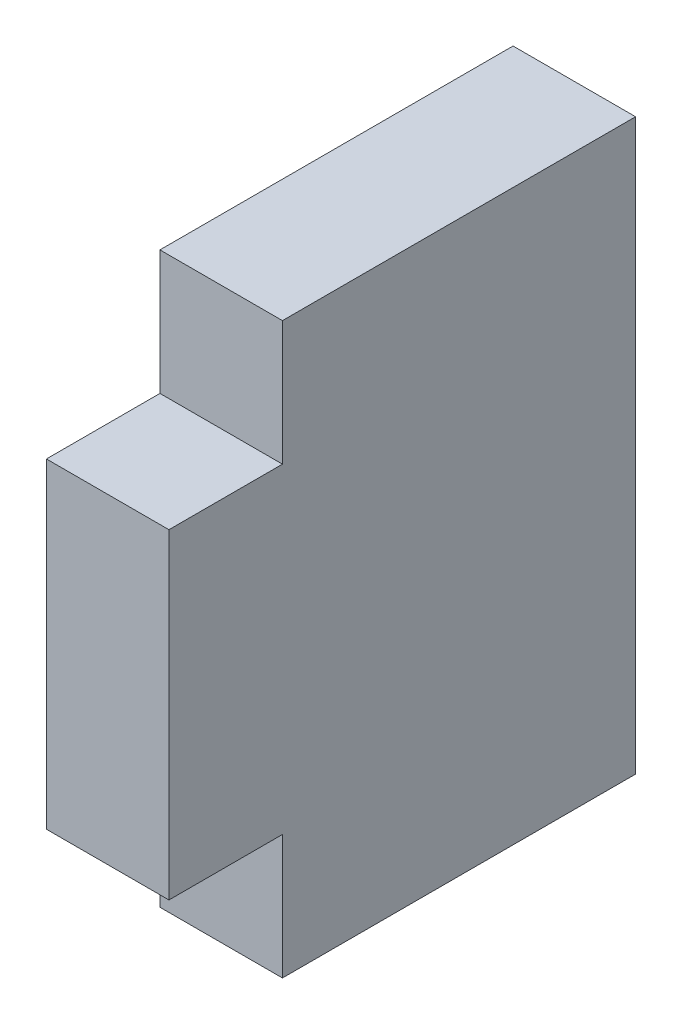
ISO-10303-21;
HEADER;
FILE_DESCRIPTION(('STEP AP214'),'2;1');
FILE_NAME('part.step','',(''),(''),'','','');
FILE_SCHEMA(('AUTOMOTIVE_DESIGN { 1 0 10303 214 1 1 1 1 }'));
ENDSEC;
DATA;
#1=APPLICATION_CONTEXT('core data for automotive mechanical design processes');
#2=APPLICATION_PROTOCOL_DEFINITION('international standard','automotive_design',2000,#1);
#3=PRODUCT_CONTEXT('',#1,'mechanical');
#4=PRODUCT('Part','Part','',(#3));
#5=PRODUCT_RELATED_PRODUCT_CATEGORY('part','',(#4));
#6=PRODUCT_DEFINITION_FORMATION('','',#4);
#7=PRODUCT_DEFINITION_CONTEXT('part definition',#1,'design');
#8=PRODUCT_DEFINITION('design','',#6,#7);
#9=PRODUCT_DEFINITION_SHAPE('','',#8);
#10=(LENGTH_UNIT() NAMED_UNIT(*) SI_UNIT(.MILLI.,.METRE.));
#11=(NAMED_UNIT(*) PLANE_ANGLE_UNIT() SI_UNIT($,.RADIAN.));
#12=(NAMED_UNIT(*) SI_UNIT($,.STERADIAN.) SOLID_ANGLE_UNIT());
#13=UNCERTAINTY_MEASURE_WITH_UNIT(LENGTH_MEASURE(1.E-05),#10,'distance_accuracy_value','');
#14=(GEOMETRIC_REPRESENTATION_CONTEXT(3) GLOBAL_UNCERTAINTY_ASSIGNED_CONTEXT((#13)) GLOBAL_UNIT_ASSIGNED_CONTEXT((#10,
#11,#12)) REPRESENTATION_CONTEXT('',''));
#15=CARTESIAN_POINT('',(0.,0.,0.));
#16=DIRECTION('',(0.,0.,1.));
#17=DIRECTION('',(1.,0.,0.));
#18=AXIS2_PLACEMENT_3D('',#15,#16,#17);
#19=CARTESIAN_POINT('',(17.272,0.,0.));
#20=DIRECTION('',(1.,0.,0.));
#21=DIRECTION('',(0.,0.,-1.));
#22=AXIS2_PLACEMENT_3D('',#19,#20,#21);
#23=PLANE('',#22);
#24=DIRECTION('',(0.,0.,1.));
#25=VECTOR('',#24,1.);
#26=CARTESIAN_POINT('',(17.272,80.264,-49.784));
#27=LINE('',#26,#25);
#28=CARTESIAN_POINT('',(17.272,80.264,0.));
#29=VERTEX_POINT('',#28);
#30=CARTESIAN_POINT('',(17.272,80.264,-49.784));
#31=VERTEX_POINT('',#30);
#32=EDGE_CURVE('E93',#29,#31,#27,.F.);
#33=ORIENTED_EDGE('',*,*,#32,.F.);
#34=DIRECTION('',(0.,1.,0.));
#35=VECTOR('',#34,1.);
#36=CARTESIAN_POINT('',(17.272,80.264,0.));
#37=LINE('',#36,#35);
#38=CARTESIAN_POINT('',(17.272,62.738,0.));
#39=VERTEX_POINT('',#38);
#40=EDGE_CURVE('E19',#39,#29,#37,.T.);
#41=ORIENTED_EDGE('',*,*,#40,.F.);
#42=DIRECTION('',(0.,0.,1.));
#43=VECTOR('',#42,1.);
#44=CARTESIAN_POINT('',(17.272,62.738,0.));
#45=LINE('',#44,#43);
#46=CARTESIAN_POINT('',(17.272,62.738,16.002));
#47=VERTEX_POINT('',#46);
#48=EDGE_CURVE('E82',#47,#39,#45,.F.);
#49=ORIENTED_EDGE('',*,*,#48,.F.);
#50=DIRECTION('',(0.,1.,0.));
#51=VECTOR('',#50,1.);
#52=CARTESIAN_POINT('',(17.272,62.738,16.002));
#53=LINE('',#52,#51);
#54=CARTESIAN_POINT('',(17.272,17.526,16.002));
#55=VERTEX_POINT('',#54);
#56=EDGE_CURVE('E77',#55,#47,#53,.T.);
#57=ORIENTED_EDGE('',*,*,#56,.F.);
#58=DIRECTION('',(0.,0.,-1.));
#59=VECTOR('',#58,1.);
#60=CARTESIAN_POINT('',(17.272,17.526,16.002));
#61=LINE('',#60,#59);
#62=CARTESIAN_POINT('',(17.272,17.526,0.));
#63=VERTEX_POINT('',#62);
#64=EDGE_CURVE('E104',#63,#55,#61,.F.);
#65=ORIENTED_EDGE('',*,*,#64,.F.);
#66=DIRECTION('',(0.,1.,0.));
#67=VECTOR('',#66,1.);
#68=CARTESIAN_POINT('',(17.272,17.526,0.));
#69=LINE('',#68,#67);
#70=CARTESIAN_POINT('',(17.272,0.,0.));
#71=VERTEX_POINT('',#70);
#72=EDGE_CURVE('E108',#71,#63,#69,.T.);
#73=ORIENTED_EDGE('',*,*,#72,.F.);
#74=DIRECTION('',(0.,0.,-1.));
#75=VECTOR('',#74,1.);
#76=CARTESIAN_POINT('',(17.272,0.,0.));
#77=LINE('',#76,#75);
#78=CARTESIAN_POINT('',(17.272,0.,-49.784));
#79=VERTEX_POINT('',#78);
#80=EDGE_CURVE('E112',#79,#71,#77,.F.);
#81=ORIENTED_EDGE('',*,*,#80,.F.);
#82=DIRECTION('',(0.,1.,0.));
#83=VECTOR('',#82,1.);
#84=CARTESIAN_POINT('',(17.272,0.,-49.784));
#85=LINE('',#84,#83);
#86=EDGE_CURVE('E116',#31,#79,#85,.F.);
#87=ORIENTED_EDGE('',*,*,#86,.F.);
#88=EDGE_LOOP('',(#33,#41,#49,#57,#65,#73,#81,#87));
#89=FACE_BOUND('',#88,.T.);
#90=ADVANCED_FACE('F16',(#89),#23,.T.);
#91=CARTESIAN_POINT('',(0.,80.264,0.));
#92=DIRECTION('',(0.,0.,1.));
#93=DIRECTION('',(1.,0.,0.));
#94=AXIS2_PLACEMENT_3D('',#91,#92,#93);
#95=PLANE('',#94);
#96=DIRECTION('',(1.,0.,0.));
#97=VECTOR('',#96,1.);
#98=CARTESIAN_POINT('',(0.,80.264,0.));
#99=LINE('',#98,#97);
#100=CARTESIAN_POINT('',(0.,80.264,0.));
#101=VERTEX_POINT('',#100);
#102=EDGE_CURVE('E120',#101,#29,#99,.T.);
#103=ORIENTED_EDGE('',*,*,#102,.F.);
#104=DIRECTION('',(0.,1.,0.));
#105=VECTOR('',#104,1.);
#106=CARTESIAN_POINT('',(0.,0.,0.));
#107=LINE('',#106,#105);
#108=CARTESIAN_POINT('',(0.,62.738,0.));
#109=VERTEX_POINT('',#108);
#110=EDGE_CURVE('E99',#101,#109,#107,.F.);
#111=ORIENTED_EDGE('',*,*,#110,.T.);
#112=DIRECTION('',(1.,0.,0.));
#113=VECTOR('',#112,1.);
#114=CARTESIAN_POINT('',(0.,62.738,0.));
#115=LINE('',#114,#113);
#116=EDGE_CURVE('E87',#39,#109,#115,.F.);
#117=ORIENTED_EDGE('',*,*,#116,.F.);
#118=ORIENTED_EDGE('',*,*,#40,.T.);
#119=EDGE_LOOP('',(#103,#111,#117,#118));
#120=FACE_BOUND('',#119,.T.);
#121=ADVANCED_FACE('F98',(#120),#95,.T.);
#122=CARTESIAN_POINT('',(0.,62.738,0.));
#123=DIRECTION('',(0.,1.,0.));
#124=DIRECTION('',(0.,0.,1.));
#125=AXIS2_PLACEMENT_3D('',#122,#123,#124);
#126=PLANE('',#125);
#127=ORIENTED_EDGE('',*,*,#116,.T.);
#128=DIRECTION('',(0.,0.,-1.));
#129=VECTOR('',#128,1.);
#130=CARTESIAN_POINT('',(0.,62.738,0.));
#131=LINE('',#130,#129);
#132=CARTESIAN_POINT('',(0.,62.738,16.002));
#133=VERTEX_POINT('',#132);
#134=EDGE_CURVE('E125',#109,#133,#131,.F.);
#135=ORIENTED_EDGE('',*,*,#134,.T.);
#136=DIRECTION('',(1.,0.,0.));
#137=VECTOR('',#136,1.);
#138=CARTESIAN_POINT('',(0.,62.738,16.002));
#139=LINE('',#138,#137);
#140=EDGE_CURVE('E89',#47,#133,#139,.F.);
#141=ORIENTED_EDGE('',*,*,#140,.F.);
#142=ORIENTED_EDGE('',*,*,#48,.T.);
#143=EDGE_LOOP('',(#127,#135,#141,#142));
#144=FACE_BOUND('',#143,.T.);
#145=ADVANCED_FACE('F84',(#144),#126,.T.);
#146=CARTESIAN_POINT('',(0.,62.738,16.002));
#147=DIRECTION('',(0.,0.,1.));
#148=DIRECTION('',(1.,0.,0.));
#149=AXIS2_PLACEMENT_3D('',#146,#147,#148);
#150=PLANE('',#149);
#151=ORIENTED_EDGE('',*,*,#140,.T.);
#152=DIRECTION('',(0.,1.,0.));
#153=VECTOR('',#152,1.);
#154=CARTESIAN_POINT('',(0.,0.,16.002));
#155=LINE('',#154,#153);
#156=CARTESIAN_POINT('',(0.,17.526,16.002));
#157=VERTEX_POINT('',#156);
#158=EDGE_CURVE('E127',#133,#157,#155,.F.);
#159=ORIENTED_EDGE('',*,*,#158,.T.);
#160=DIRECTION('',(1.,0.,0.));
#161=VECTOR('',#160,1.);
#162=CARTESIAN_POINT('',(0.,17.526,16.002));
#163=LINE('',#162,#161);
#164=EDGE_CURVE('E106',#55,#157,#163,.F.);
#165=ORIENTED_EDGE('',*,*,#164,.F.);
#166=ORIENTED_EDGE('',*,*,#56,.T.);
#167=EDGE_LOOP('',(#151,#159,#165,#166));
#168=FACE_BOUND('',#167,.T.);
#169=ADVANCED_FACE('F161',(#168),#150,.T.);
#170=CARTESIAN_POINT('',(0.,17.526,16.002));
#171=DIRECTION('',(0.,-1.,0.));
#172=DIRECTION('',(0.,0.,-1.));
#173=AXIS2_PLACEMENT_3D('',#170,#171,#172);
#174=PLANE('',#173);
#175=ORIENTED_EDGE('',*,*,#164,.T.);
#176=DIRECTION('',(0.,0.,-1.));
#177=VECTOR('',#176,1.);
#178=CARTESIAN_POINT('',(0.,17.526,0.));
#179=LINE('',#178,#177);
#180=CARTESIAN_POINT('',(0.,17.526,0.));
#181=VERTEX_POINT('',#180);
#182=EDGE_CURVE('E130',#157,#181,#179,.T.);
#183=ORIENTED_EDGE('',*,*,#182,.T.);
#184=DIRECTION('',(1.,0.,0.));
#185=VECTOR('',#184,1.);
#186=CARTESIAN_POINT('',(0.,17.526,0.));
#187=LINE('',#186,#185);
#188=EDGE_CURVE('E110',#63,#181,#187,.F.);
#189=ORIENTED_EDGE('',*,*,#188,.F.);
#190=ORIENTED_EDGE('',*,*,#64,.T.);
#191=EDGE_LOOP('',(#175,#183,#189,#190));
#192=FACE_BOUND('',#191,.T.);
#193=ADVANCED_FACE('F160',(#192),#174,.T.);
#194=CARTESIAN_POINT('',(0.,17.526,0.));
#195=DIRECTION('',(0.,0.,1.));
#196=DIRECTION('',(1.,0.,0.));
#197=AXIS2_PLACEMENT_3D('',#194,#195,#196);
#198=PLANE('',#197);
#199=ORIENTED_EDGE('',*,*,#188,.T.);
#200=DIRECTION('',(0.,1.,0.));
#201=VECTOR('',#200,1.);
#202=CARTESIAN_POINT('',(0.,0.,0.));
#203=LINE('',#202,#201);
#204=CARTESIAN_POINT('',(0.,0.,0.));
#205=VERTEX_POINT('',#204);
#206=EDGE_CURVE('E133',#181,#205,#203,.F.);
#207=ORIENTED_EDGE('',*,*,#206,.T.);
#208=DIRECTION('',(1.,0.,0.));
#209=VECTOR('',#208,1.);
#210=CARTESIAN_POINT('',(0.,0.,0.));
#211=LINE('',#210,#209);
#212=EDGE_CURVE('E114',#71,#205,#211,.F.);
#213=ORIENTED_EDGE('',*,*,#212,.F.);
#214=ORIENTED_EDGE('',*,*,#72,.T.);
#215=EDGE_LOOP('',(#199,#207,#213,#214));
#216=FACE_BOUND('',#215,.T.);
#217=ADVANCED_FACE('F154',(#216),#198,.T.);
#218=CARTESIAN_POINT('',(0.,0.,0.));
#219=DIRECTION('',(0.,-1.,0.));
#220=DIRECTION('',(0.,0.,-1.));
#221=AXIS2_PLACEMENT_3D('',#218,#219,#220);
#222=PLANE('',#221);
#223=ORIENTED_EDGE('',*,*,#212,.T.);
#224=DIRECTION('',(0.,0.,-1.));
#225=VECTOR('',#224,1.);
#226=CARTESIAN_POINT('',(0.,0.,0.));
#227=LINE('',#226,#225);
#228=CARTESIAN_POINT('',(0.,0.,-49.784));
#229=VERTEX_POINT('',#228);
#230=EDGE_CURVE('E136',#205,#229,#227,.T.);
#231=ORIENTED_EDGE('',*,*,#230,.T.);
#232=DIRECTION('',(-1.,0.,0.));
#233=VECTOR('',#232,1.);
#234=CARTESIAN_POINT('',(0.,0.,-49.784));
#235=LINE('',#234,#233);
#236=EDGE_CURVE('E118',#79,#229,#235,.T.);
#237=ORIENTED_EDGE('',*,*,#236,.F.);
#238=ORIENTED_EDGE('',*,*,#80,.T.);
#239=EDGE_LOOP('',(#223,#231,#237,#238));
#240=FACE_BOUND('',#239,.T.);
#241=ADVANCED_FACE('F149',(#240),#222,.T.);
#242=CARTESIAN_POINT('',(0.,0.,-49.784));
#243=DIRECTION('',(0.,0.,-1.));
#244=DIRECTION('',(-1.,0.,0.));
#245=AXIS2_PLACEMENT_3D('',#242,#243,#244);
#246=PLANE('',#245);
#247=ORIENTED_EDGE('',*,*,#236,.T.);
#248=DIRECTION('',(0.,1.,0.));
#249=VECTOR('',#248,1.);
#250=CARTESIAN_POINT('',(0.,0.,-49.784));
#251=LINE('',#250,#249);
#252=CARTESIAN_POINT('',(0.,80.264,-49.784));
#253=VERTEX_POINT('',#252);
#254=EDGE_CURVE('E25',#229,#253,#251,.T.);
#255=ORIENTED_EDGE('',*,*,#254,.T.);
#256=DIRECTION('',(1.,0.,0.));
#257=VECTOR('',#256,1.);
#258=CARTESIAN_POINT('',(0.,80.264,-49.784));
#259=LINE('',#258,#257);
#260=EDGE_CURVE('E33',#31,#253,#259,.F.);
#261=ORIENTED_EDGE('',*,*,#260,.F.);
#262=ORIENTED_EDGE('',*,*,#86,.T.);
#263=EDGE_LOOP('',(#247,#255,#261,#262));
#264=FACE_BOUND('',#263,.T.);
#265=ADVANCED_FACE('F142',(#264),#246,.T.);
#266=CARTESIAN_POINT('',(0.,80.264,-49.784));
#267=DIRECTION('',(0.,1.,0.));
#268=DIRECTION('',(0.,0.,1.));
#269=AXIS2_PLACEMENT_3D('',#266,#267,#268);
#270=PLANE('',#269);
#271=ORIENTED_EDGE('',*,*,#260,.T.);
#272=DIRECTION('',(0.,0.,-1.));
#273=VECTOR('',#272,1.);
#274=CARTESIAN_POINT('',(0.,80.264,0.));
#275=LINE('',#274,#273);
#276=EDGE_CURVE('E10',#253,#101,#275,.F.);
#277=ORIENTED_EDGE('',*,*,#276,.T.);
#278=ORIENTED_EDGE('',*,*,#102,.T.);
#279=ORIENTED_EDGE('',*,*,#32,.T.);
#280=EDGE_LOOP('',(#271,#277,#278,#279));
#281=FACE_BOUND('',#280,.T.);
#282=ADVANCED_FACE('F162',(#281),#270,.T.);
#283=CARTESIAN_POINT('',(0.,0.,0.));
#284=DIRECTION('',(1.,0.,0.));
#285=DIRECTION('',(0.,0.,-1.));
#286=AXIS2_PLACEMENT_3D('',#283,#284,#285);
#287=PLANE('',#286);
#288=ORIENTED_EDGE('',*,*,#254,.F.);
#289=ORIENTED_EDGE('',*,*,#230,.F.);
#290=ORIENTED_EDGE('',*,*,#206,.F.);
#291=ORIENTED_EDGE('',*,*,#182,.F.);
#292=ORIENTED_EDGE('',*,*,#158,.F.);
#293=ORIENTED_EDGE('',*,*,#134,.F.);
#294=ORIENTED_EDGE('',*,*,#110,.F.);
#295=ORIENTED_EDGE('',*,*,#276,.F.);
#296=EDGE_LOOP('',(#288,#289,#290,#291,#292,#293,#294,#295));
#297=FACE_BOUND('',#296,.T.);
#298=ADVANCED_FACE('F146',(#297),#287,.F.);
#299=CLOSED_SHELL('',(#90,#121,#145,#169,#193,#217,#241,#265,#282,#298));
#300=MANIFOLD_SOLID_BREP('B1',#299);
#301=ADVANCED_BREP_SHAPE_REPRESENTATION('',(#18,#300),#14);
#302=SHAPE_DEFINITION_REPRESENTATION(#9,#301);
ENDSEC;
END-ISO-10303-21;
